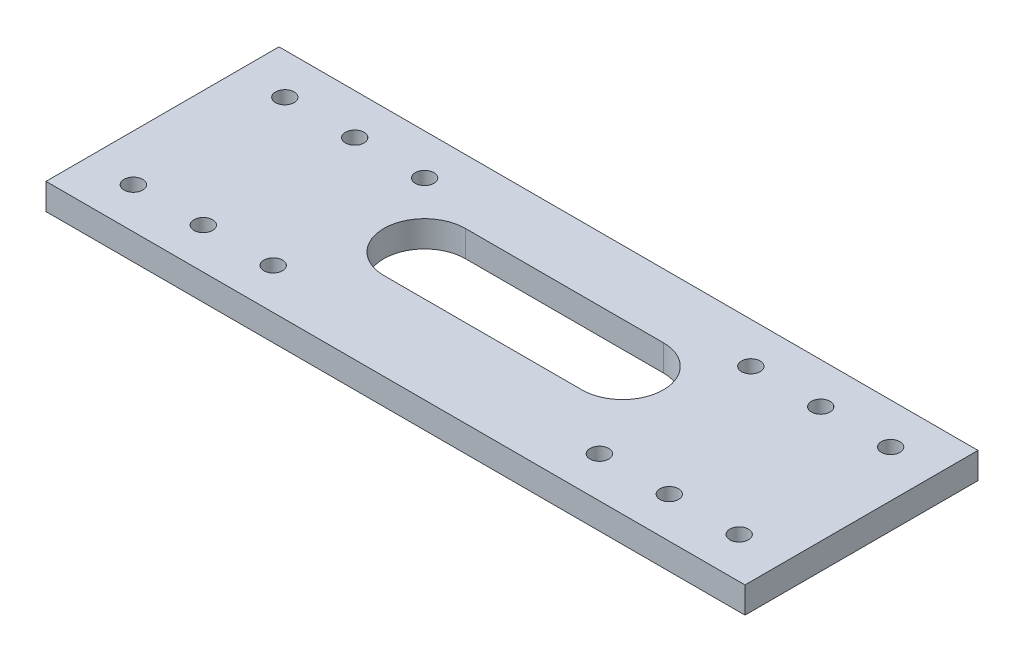
ISO-10303-21;
HEADER;
FILE_DESCRIPTION(('STEP AP214'),'2;1');
FILE_NAME('part.step','',(''),(''),'','','');
FILE_SCHEMA(('AUTOMOTIVE_DESIGN { 1 0 10303 214 1 1 1 1 }'));
ENDSEC;
DATA;
#1=APPLICATION_CONTEXT('core data for automotive mechanical design processes');
#2=APPLICATION_PROTOCOL_DEFINITION('international standard','automotive_design',2000,#1);
#3=PRODUCT_CONTEXT('',#1,'mechanical');
#4=PRODUCT('Part','Part','',(#3));
#5=PRODUCT_RELATED_PRODUCT_CATEGORY('part','',(#4));
#6=PRODUCT_DEFINITION_FORMATION('','',#4);
#7=PRODUCT_DEFINITION_CONTEXT('part definition',#1,'design');
#8=PRODUCT_DEFINITION('design','',#6,#7);
#9=PRODUCT_DEFINITION_SHAPE('','',#8);
#10=(LENGTH_UNIT() NAMED_UNIT(*) SI_UNIT(.MILLI.,.METRE.));
#11=(NAMED_UNIT(*) PLANE_ANGLE_UNIT() SI_UNIT($,.RADIAN.));
#12=(NAMED_UNIT(*) SI_UNIT($,.STERADIAN.) SOLID_ANGLE_UNIT());
#13=UNCERTAINTY_MEASURE_WITH_UNIT(LENGTH_MEASURE(1.E-05),#10,'distance_accuracy_value','');
#14=(GEOMETRIC_REPRESENTATION_CONTEXT(3) GLOBAL_UNCERTAINTY_ASSIGNED_CONTEXT((#13)) GLOBAL_UNIT_ASSIGNED_CONTEXT((#10,
#11,#12)) REPRESENTATION_CONTEXT('',''));
#15=CARTESIAN_POINT('',(0.,0.,0.));
#16=DIRECTION('',(0.,0.,1.));
#17=DIRECTION('',(1.,0.,0.));
#18=AXIS2_PLACEMENT_3D('',#15,#16,#17);
#19=CARTESIAN_POINT('',(0.,4.5,0.));
#20=DIRECTION('',(1.,0.,0.));
#21=DIRECTION('',(0.,0.,-1.));
#22=AXIS2_PLACEMENT_3D('',#19,#20,#21);
#23=PLANE('',#22);
#24=DIRECTION('',(0.,0.,1.));
#25=VECTOR('',#24,1.);
#26=CARTESIAN_POINT('',(0.,0.,0.));
#27=LINE('',#26,#25);
#28=CARTESIAN_POINT('',(0.,0.,-40.));
#29=VERTEX_POINT('',#28);
#30=CARTESIAN_POINT('',(0.,0.,0.));
#31=VERTEX_POINT('',#30);
#32=EDGE_CURVE('E193',#29,#31,#27,.T.);
#33=ORIENTED_EDGE('',*,*,#32,.T.);
#34=DIRECTION('',(0.,-1.,0.));
#35=VECTOR('',#34,1.);
#36=CARTESIAN_POINT('',(0.,4.5,0.));
#37=LINE('',#36,#35);
#38=CARTESIAN_POINT('',(0.,4.5,0.));
#39=VERTEX_POINT('',#38);
#40=EDGE_CURVE('E11',#39,#31,#37,.T.);
#41=ORIENTED_EDGE('',*,*,#40,.F.);
#42=DIRECTION('',(0.,0.,1.));
#43=VECTOR('',#42,1.);
#44=CARTESIAN_POINT('',(0.,4.5,0.));
#45=LINE('',#44,#43);
#46=CARTESIAN_POINT('',(0.,4.5,-40.));
#47=VERTEX_POINT('',#46);
#48=EDGE_CURVE('E196',#47,#39,#45,.T.);
#49=ORIENTED_EDGE('',*,*,#48,.F.);
#50=DIRECTION('',(0.,-1.,0.));
#51=VECTOR('',#50,1.);
#52=CARTESIAN_POINT('',(0.,4.5,-40.));
#53=LINE('',#52,#51);
#54=EDGE_CURVE('E206',#47,#29,#53,.T.);
#55=ORIENTED_EDGE('',*,*,#54,.T.);
#56=EDGE_LOOP('',(#33,#41,#49,#55));
#57=FACE_BOUND('',#56,.T.);
#58=ADVANCED_FACE('F37',(#57),#23,.F.);
#59=CARTESIAN_POINT('',(0.,4.5,0.));
#60=DIRECTION('',(0.,0.,-1.));
#61=DIRECTION('',(-1.,0.,0.));
#62=AXIS2_PLACEMENT_3D('',#59,#60,#61);
#63=PLANE('',#62);
#64=DIRECTION('',(1.,0.,0.));
#65=VECTOR('',#64,1.);
#66=CARTESIAN_POINT('',(0.,0.,0.));
#67=LINE('',#66,#65);
#68=CARTESIAN_POINT('',(120.,0.,0.));
#69=VERTEX_POINT('',#68);
#70=EDGE_CURVE('E209',#31,#69,#67,.T.);
#71=ORIENTED_EDGE('',*,*,#70,.T.);
#72=DIRECTION('',(0.,-1.,0.));
#73=VECTOR('',#72,1.);
#74=CARTESIAN_POINT('',(120.,4.5,0.));
#75=LINE('',#74,#73);
#76=CARTESIAN_POINT('',(120.,4.5,0.));
#77=VERTEX_POINT('',#76);
#78=EDGE_CURVE('E44',#77,#69,#75,.T.);
#79=ORIENTED_EDGE('',*,*,#78,.F.);
#80=DIRECTION('',(1.,0.,0.));
#81=VECTOR('',#80,1.);
#82=CARTESIAN_POINT('',(0.,4.5,0.));
#83=LINE('',#82,#81);
#84=EDGE_CURVE('E199',#39,#77,#83,.T.);
#85=ORIENTED_EDGE('',*,*,#84,.F.);
#86=ORIENTED_EDGE('',*,*,#40,.T.);
#87=EDGE_LOOP('',(#71,#79,#85,#86));
#88=FACE_BOUND('',#87,.T.);
#89=ADVANCED_FACE('F238',(#88),#63,.F.);
#90=CARTESIAN_POINT('',(120.,4.5,0.));
#91=DIRECTION('',(-1.,0.,0.));
#92=DIRECTION('',(0.,0.,1.));
#93=AXIS2_PLACEMENT_3D('',#90,#91,#92);
#94=PLANE('',#93);
#95=DIRECTION('',(0.,0.,-1.));
#96=VECTOR('',#95,1.);
#97=CARTESIAN_POINT('',(120.,0.,0.));
#98=LINE('',#97,#96);
#99=CARTESIAN_POINT('',(120.,0.,-40.));
#100=VERTEX_POINT('',#99);
#101=EDGE_CURVE('E211',#69,#100,#98,.T.);
#102=ORIENTED_EDGE('',*,*,#101,.T.);
#103=DIRECTION('',(0.,-1.,0.));
#104=VECTOR('',#103,1.);
#105=CARTESIAN_POINT('',(120.,4.5,-40.));
#106=LINE('',#105,#104);
#107=CARTESIAN_POINT('',(120.,4.5,-40.));
#108=VERTEX_POINT('',#107);
#109=EDGE_CURVE('E216',#108,#100,#106,.T.);
#110=ORIENTED_EDGE('',*,*,#109,.F.);
#111=DIRECTION('',(0.,0.,-1.));
#112=VECTOR('',#111,1.);
#113=CARTESIAN_POINT('',(120.,4.5,0.));
#114=LINE('',#113,#112);
#115=EDGE_CURVE('E202',#77,#108,#114,.T.);
#116=ORIENTED_EDGE('',*,*,#115,.F.);
#117=ORIENTED_EDGE('',*,*,#78,.T.);
#118=EDGE_LOOP('',(#102,#110,#116,#117));
#119=FACE_BOUND('',#118,.T.);
#120=ADVANCED_FACE('F223',(#119),#94,.F.);
#121=CARTESIAN_POINT('',(0.,4.5,-40.));
#122=DIRECTION('',(0.,0.,1.));
#123=DIRECTION('',(1.,0.,0.));
#124=AXIS2_PLACEMENT_3D('',#121,#122,#123);
#125=PLANE('',#124);
#126=DIRECTION('',(-1.,0.,0.));
#127=VECTOR('',#126,1.);
#128=CARTESIAN_POINT('',(0.,0.,-40.));
#129=LINE('',#128,#127);
#130=EDGE_CURVE('E200',#100,#29,#129,.T.);
#131=ORIENTED_EDGE('',*,*,#130,.T.);
#132=ORIENTED_EDGE('',*,*,#54,.F.);
#133=DIRECTION('',(-1.,0.,0.));
#134=VECTOR('',#133,1.);
#135=CARTESIAN_POINT('',(0.,4.5,-40.));
#136=LINE('',#135,#134);
#137=EDGE_CURVE('E204',#108,#47,#136,.T.);
#138=ORIENTED_EDGE('',*,*,#137,.F.);
#139=ORIENTED_EDGE('',*,*,#109,.T.);
#140=EDGE_LOOP('',(#131,#132,#138,#139));
#141=FACE_BOUND('',#140,.T.);
#142=ADVANCED_FACE('F232',(#141),#125,.F.);
#143=CARTESIAN_POINT('',(0.,4.5,0.));
#144=DIRECTION('',(0.,-1.,0.));
#145=DIRECTION('',(0.,0.,-1.));
#146=AXIS2_PLACEMENT_3D('',#143,#144,#145);
#147=PLANE('',#146);
#148=CARTESIAN_POINT('',(112.,4.5,-7.00000000000265));
#149=DIRECTION('',(0.,-1.,0.));
#150=DIRECTION('',(0.,0.,-1.));
#151=AXIS2_PLACEMENT_3D('',#148,#149,#150);
#152=CIRCLE('',#151,1.60000000000067);
#153=CARTESIAN_POINT('',(112.,4.5,-8.60000000000332));
#154=VERTEX_POINT('',#153);
#155=EDGE_CURVE('E159',#154,#154,#152,.T.);
#156=ORIENTED_EDGE('',*,*,#155,.T.);
#157=EDGE_LOOP('',(#156));
#158=FACE_BOUND('',#157,.T.);
#159=CARTESIAN_POINT('',(112.,4.5,-33.0000000000026));
#160=DIRECTION('',(0.,-1.,0.));
#161=DIRECTION('',(0.,0.,-1.));
#162=AXIS2_PLACEMENT_3D('',#159,#160,#161);
#163=CIRCLE('',#162,1.60000000000067);
#164=CARTESIAN_POINT('',(112.,4.5,-34.6000000000033));
#165=VERTEX_POINT('',#164);
#166=EDGE_CURVE('E153',#165,#165,#163,.T.);
#167=ORIENTED_EDGE('',*,*,#166,.T.);
#168=EDGE_LOOP('',(#167));
#169=FACE_BOUND('',#168,.T.);
#170=CARTESIAN_POINT('',(20.,4.5,-7.00000000000264));
#171=DIRECTION('',(0.,-1.,0.));
#172=DIRECTION('',(0.,0.,-1.));
#173=AXIS2_PLACEMENT_3D('',#170,#171,#172);
#174=CIRCLE('',#173,1.60000000000067);
#175=CARTESIAN_POINT('',(20.,4.5,-8.60000000000331));
#176=VERTEX_POINT('',#175);
#177=EDGE_CURVE('E147',#176,#176,#174,.T.);
#178=ORIENTED_EDGE('',*,*,#177,.T.);
#179=EDGE_LOOP('',(#178));
#180=FACE_BOUND('',#179,.T.);
#181=CARTESIAN_POINT('',(100.,4.5,-7.00000000000266));
#182=DIRECTION('',(0.,-1.,0.));
#183=DIRECTION('',(0.,0.,-1.));
#184=AXIS2_PLACEMENT_3D('',#181,#182,#183);
#185=CIRCLE('',#184,1.60000000000067);
#186=CARTESIAN_POINT('',(100.,4.5,-8.60000000000333));
#187=VERTEX_POINT('',#186);
#188=EDGE_CURVE('E140',#187,#187,#185,.T.);
#189=ORIENTED_EDGE('',*,*,#188,.T.);
#190=EDGE_LOOP('',(#189));
#191=FACE_BOUND('',#190,.T.);
#192=CARTESIAN_POINT('',(32.,4.5,-33.0000000000026));
#193=DIRECTION('',(0.,-1.,0.));
#194=DIRECTION('',(0.,0.,-1.));
#195=AXIS2_PLACEMENT_3D('',#192,#193,#194);
#196=CIRCLE('',#195,1.60000000000066);
#197=CARTESIAN_POINT('',(32.,4.5,-34.6000000000033));
#198=VERTEX_POINT('',#197);
#199=EDGE_CURVE('E178',#198,#198,#196,.T.);
#200=ORIENTED_EDGE('',*,*,#199,.T.);
#201=EDGE_LOOP('',(#200));
#202=FACE_BOUND('',#201,.T.);
#203=CARTESIAN_POINT('',(32.,4.5,-7.00000000000264));
#204=DIRECTION('',(0.,-1.,0.));
#205=DIRECTION('',(0.,0.,-1.));
#206=AXIS2_PLACEMENT_3D('',#203,#204,#205);
#207=CIRCLE('',#206,1.60000000000066);
#208=CARTESIAN_POINT('',(32.,4.5,-8.60000000000331));
#209=VERTEX_POINT('',#208);
#210=EDGE_CURVE('E185',#209,#209,#207,.T.);
#211=ORIENTED_EDGE('',*,*,#210,.T.);
#212=EDGE_LOOP('',(#211));
#213=FACE_BOUND('',#212,.T.);
#214=CARTESIAN_POINT('',(100.,4.5,-33.0000000000026));
#215=DIRECTION('',(0.,-1.,0.));
#216=DIRECTION('',(0.,0.,-1.));
#217=AXIS2_PLACEMENT_3D('',#214,#215,#216);
#218=CIRCLE('',#217,1.60000000000067);
#219=CARTESIAN_POINT('',(100.,4.5,-34.6000000000033));
#220=VERTEX_POINT('',#219);
#221=EDGE_CURVE('E166',#220,#220,#218,.T.);
#222=ORIENTED_EDGE('',*,*,#221,.T.);
#223=EDGE_LOOP('',(#222));
#224=FACE_BOUND('',#223,.T.);
#225=CARTESIAN_POINT('',(20.,4.5,-33.0000000000026));
#226=DIRECTION('',(0.,-1.,0.));
#227=DIRECTION('',(0.,0.,-1.));
#228=AXIS2_PLACEMENT_3D('',#225,#226,#227);
#229=CIRCLE('',#228,1.60000000000067);
#230=CARTESIAN_POINT('',(20.,4.5,-34.6000000000033));
#231=VERTEX_POINT('',#230);
#232=EDGE_CURVE('E173',#231,#231,#229,.T.);
#233=ORIENTED_EDGE('',*,*,#232,.T.);
#234=EDGE_LOOP('',(#233));
#235=FACE_BOUND('',#234,.T.);
#236=CARTESIAN_POINT('',(8.,4.5,-33.0000000000026));
#237=DIRECTION('',(0.,-1.,0.));
#238=DIRECTION('',(0.,0.,-1.));
#239=AXIS2_PLACEMENT_3D('',#236,#237,#238);
#240=CIRCLE('',#239,1.60000000000067);
#241=CARTESIAN_POINT('',(8.,4.5,-34.6000000000033));
#242=VERTEX_POINT('',#241);
#243=EDGE_CURVE('E165',#242,#242,#240,.T.);
#244=ORIENTED_EDGE('',*,*,#243,.T.);
#245=EDGE_LOOP('',(#244));
#246=FACE_BOUND('',#245,.T.);
#247=CARTESIAN_POINT('',(88.,4.5,-33.0000000000026));
#248=DIRECTION('',(0.,-1.,0.));
#249=DIRECTION('',(0.,0.,-1.));
#250=AXIS2_PLACEMENT_3D('',#247,#248,#249);
#251=CIRCLE('',#250,1.60000000000067);
#252=CARTESIAN_POINT('',(88.,4.5,-34.6000000000033));
#253=VERTEX_POINT('',#252);
#254=EDGE_CURVE('E321',#253,#253,#251,.T.);
#255=ORIENTED_EDGE('',*,*,#254,.T.);
#256=EDGE_LOOP('',(#255));
#257=FACE_BOUND('',#256,.T.);
#258=CARTESIAN_POINT('',(88.,4.5,-7.00000000000266));
#259=DIRECTION('',(0.,-1.,0.));
#260=DIRECTION('',(0.,0.,-1.));
#261=AXIS2_PLACEMENT_3D('',#258,#259,#260);
#262=CIRCLE('',#261,1.60000000000067);
#263=CARTESIAN_POINT('',(88.,4.5,-8.60000000000333));
#264=VERTEX_POINT('',#263);
#265=EDGE_CURVE('E329',#264,#264,#262,.T.);
#266=ORIENTED_EDGE('',*,*,#265,.T.);
#267=EDGE_LOOP('',(#266));
#268=FACE_BOUND('',#267,.T.);
#269=DIRECTION('',(-1.,0.,0.));
#270=VECTOR('',#269,1.);
#271=CARTESIAN_POINT('',(77.,4.5,-15.0000000000026));
#272=LINE('',#271,#270);
#273=CARTESIAN_POINT('',(77.,4.5,-15.0000000000026));
#274=VERTEX_POINT('',#273);
#275=CARTESIAN_POINT('',(43.,4.5,-15.0000000000026));
#276=VERTEX_POINT('',#275);
#277=EDGE_CURVE('E109',#274,#276,#272,.T.);
#278=ORIENTED_EDGE('',*,*,#277,.T.);
#279=CARTESIAN_POINT('',(43.,4.5,-22.0000000000026));
#280=DIRECTION('',(0.,-1.,0.));
#281=DIRECTION('',(0.,0.,-1.));
#282=AXIS2_PLACEMENT_3D('',#279,#280,#281);
#283=CIRCLE('',#282,7.);
#284=CARTESIAN_POINT('',(43.,4.5,-29.0000000000026));
#285=VERTEX_POINT('',#284);
#286=EDGE_CURVE('E103',#276,#285,#283,.T.);
#287=ORIENTED_EDGE('',*,*,#286,.T.);
#288=DIRECTION('',(1.,0.,0.));
#289=VECTOR('',#288,1.);
#290=CARTESIAN_POINT('',(43.,4.5,-29.0000000000026));
#291=LINE('',#290,#289);
#292=CARTESIAN_POINT('',(77.,4.5,-29.0000000000026));
#293=VERTEX_POINT('',#292);
#294=EDGE_CURVE('E112',#285,#293,#291,.T.);
#295=ORIENTED_EDGE('',*,*,#294,.T.);
#296=CARTESIAN_POINT('',(77.,4.5,-22.0000000000026));
#297=DIRECTION('',(0.,-1.,0.));
#298=DIRECTION('',(0.,0.,-1.));
#299=AXIS2_PLACEMENT_3D('',#296,#297,#298);
#300=CIRCLE('',#299,7.);
#301=EDGE_CURVE('E51',#293,#274,#300,.T.);
#302=ORIENTED_EDGE('',*,*,#301,.T.);
#303=EDGE_LOOP('',(#278,#287,#295,#302));
#304=FACE_BOUND('',#303,.T.);
#305=CARTESIAN_POINT('',(8.,4.5,-7.00000000000265));
#306=DIRECTION('',(0.,-1.,0.));
#307=DIRECTION('',(0.,0.,-1.));
#308=AXIS2_PLACEMENT_3D('',#305,#306,#307);
#309=CIRCLE('',#308,1.60000000000067);
#310=CARTESIAN_POINT('',(8.,4.5,-8.60000000000332));
#311=VERTEX_POINT('',#310);
#312=EDGE_CURVE('E190',#311,#311,#309,.T.);
#313=ORIENTED_EDGE('',*,*,#312,.T.);
#314=EDGE_LOOP('',(#313));
#315=FACE_BOUND('',#314,.T.);
#316=ORIENTED_EDGE('',*,*,#48,.T.);
#317=ORIENTED_EDGE('',*,*,#84,.T.);
#318=ORIENTED_EDGE('',*,*,#115,.T.);
#319=ORIENTED_EDGE('',*,*,#137,.T.);
#320=EDGE_LOOP('',(#316,#317,#318,#319));
#321=FACE_BOUND('',#320,.T.);
#322=ADVANCED_FACE('F116',(#158,#169,#180,#191,#202,#213,#224,#235,#246,#257,#268,#304,#315,
#321),#147,.F.);
#323=CARTESIAN_POINT('',(0.,0.,0.));
#324=DIRECTION('',(0.,-1.,0.));
#325=DIRECTION('',(0.,0.,-1.));
#326=AXIS2_PLACEMENT_3D('',#323,#324,#325);
#327=PLANE('',#326);
#328=CARTESIAN_POINT('',(112.,0.,-7.00000000000265));
#329=DIRECTION('',(0.,-1.,0.));
#330=DIRECTION('',(0.,0.,-1.));
#331=AXIS2_PLACEMENT_3D('',#328,#329,#330);
#332=CIRCLE('',#331,1.60000000000067);
#333=CARTESIAN_POINT('',(112.,0.,-8.60000000000332));
#334=VERTEX_POINT('',#333);
#335=EDGE_CURVE('E162',#334,#334,#332,.T.);
#336=ORIENTED_EDGE('',*,*,#335,.F.);
#337=EDGE_LOOP('',(#336));
#338=FACE_BOUND('',#337,.T.);
#339=CARTESIAN_POINT('',(112.,0.,-33.0000000000026));
#340=DIRECTION('',(0.,-1.,0.));
#341=DIRECTION('',(0.,0.,-1.));
#342=AXIS2_PLACEMENT_3D('',#339,#340,#341);
#343=CIRCLE('',#342,1.60000000000067);
#344=CARTESIAN_POINT('',(112.,0.,-34.6000000000033));
#345=VERTEX_POINT('',#344);
#346=EDGE_CURVE('E156',#345,#345,#343,.T.);
#347=ORIENTED_EDGE('',*,*,#346,.F.);
#348=EDGE_LOOP('',(#347));
#349=FACE_BOUND('',#348,.T.);
#350=CARTESIAN_POINT('',(20.,0.,-7.00000000000264));
#351=DIRECTION('',(0.,-1.,0.));
#352=DIRECTION('',(0.,0.,-1.));
#353=AXIS2_PLACEMENT_3D('',#350,#351,#352);
#354=CIRCLE('',#353,1.60000000000067);
#355=CARTESIAN_POINT('',(20.,0.,-8.60000000000331));
#356=VERTEX_POINT('',#355);
#357=EDGE_CURVE('E150',#356,#356,#354,.T.);
#358=ORIENTED_EDGE('',*,*,#357,.F.);
#359=EDGE_LOOP('',(#358));
#360=FACE_BOUND('',#359,.T.);
#361=CARTESIAN_POINT('',(100.,0.,-7.00000000000266));
#362=DIRECTION('',(0.,-1.,0.));
#363=DIRECTION('',(0.,0.,-1.));
#364=AXIS2_PLACEMENT_3D('',#361,#362,#363);
#365=CIRCLE('',#364,1.60000000000067);
#366=CARTESIAN_POINT('',(100.,0.,-8.60000000000333));
#367=VERTEX_POINT('',#366);
#368=EDGE_CURVE('E144',#367,#367,#365,.T.);
#369=ORIENTED_EDGE('',*,*,#368,.F.);
#370=EDGE_LOOP('',(#369));
#371=FACE_BOUND('',#370,.T.);
#372=CARTESIAN_POINT('',(32.,0.,-33.0000000000026));
#373=DIRECTION('',(0.,-1.,0.));
#374=DIRECTION('',(0.,0.,-1.));
#375=AXIS2_PLACEMENT_3D('',#372,#373,#374);
#376=CIRCLE('',#375,1.60000000000066);
#377=CARTESIAN_POINT('',(32.,0.,-34.6000000000033));
#378=VERTEX_POINT('',#377);
#379=EDGE_CURVE('E182',#378,#378,#376,.T.);
#380=ORIENTED_EDGE('',*,*,#379,.F.);
#381=EDGE_LOOP('',(#380));
#382=FACE_BOUND('',#381,.T.);
#383=CARTESIAN_POINT('',(32.,0.,-7.00000000000264));
#384=DIRECTION('',(0.,-1.,0.));
#385=DIRECTION('',(0.,0.,-1.));
#386=AXIS2_PLACEMENT_3D('',#383,#384,#385);
#387=CIRCLE('',#386,1.60000000000066);
#388=CARTESIAN_POINT('',(32.,0.,-8.60000000000331));
#389=VERTEX_POINT('',#388);
#390=EDGE_CURVE('E169',#389,#389,#387,.T.);
#391=ORIENTED_EDGE('',*,*,#390,.F.);
#392=EDGE_LOOP('',(#391));
#393=FACE_BOUND('',#392,.T.);
#394=CARTESIAN_POINT('',(100.,0.,-33.0000000000026));
#395=DIRECTION('',(0.,-1.,0.));
#396=DIRECTION('',(0.,0.,-1.));
#397=AXIS2_PLACEMENT_3D('',#394,#395,#396);
#398=CIRCLE('',#397,1.60000000000067);
#399=CARTESIAN_POINT('',(100.,0.,-34.6000000000033));
#400=VERTEX_POINT('',#399);
#401=EDGE_CURVE('E170',#400,#400,#398,.T.);
#402=ORIENTED_EDGE('',*,*,#401,.F.);
#403=EDGE_LOOP('',(#402));
#404=FACE_BOUND('',#403,.T.);
#405=CARTESIAN_POINT('',(20.,0.,-33.0000000000026));
#406=DIRECTION('',(0.,-1.,0.));
#407=DIRECTION('',(0.,0.,-1.));
#408=AXIS2_PLACEMENT_3D('',#405,#406,#407);
#409=CIRCLE('',#408,1.60000000000067);
#410=CARTESIAN_POINT('',(20.,0.,-34.6000000000033));
#411=VERTEX_POINT('',#410);
#412=EDGE_CURVE('E143',#411,#411,#409,.T.);
#413=ORIENTED_EDGE('',*,*,#412,.F.);
#414=EDGE_LOOP('',(#413));
#415=FACE_BOUND('',#414,.T.);
#416=CARTESIAN_POINT('',(8.,0.,-33.0000000000026));
#417=DIRECTION('',(0.,-1.,0.));
#418=DIRECTION('',(0.,0.,-1.));
#419=AXIS2_PLACEMENT_3D('',#416,#417,#418);
#420=CIRCLE('',#419,1.60000000000067);
#421=CARTESIAN_POINT('',(8.,0.,-34.6000000000033));
#422=VERTEX_POINT('',#421);
#423=EDGE_CURVE('E319',#422,#422,#420,.T.);
#424=ORIENTED_EDGE('',*,*,#423,.F.);
#425=EDGE_LOOP('',(#424));
#426=FACE_BOUND('',#425,.T.);
#427=CARTESIAN_POINT('',(88.,0.,-33.0000000000026));
#428=DIRECTION('',(0.,-1.,0.));
#429=DIRECTION('',(0.,0.,-1.));
#430=AXIS2_PLACEMENT_3D('',#427,#428,#429);
#431=CIRCLE('',#430,1.60000000000067);
#432=CARTESIAN_POINT('',(88.,0.,-34.6000000000033));
#433=VERTEX_POINT('',#432);
#434=EDGE_CURVE('E325',#433,#433,#431,.T.);
#435=ORIENTED_EDGE('',*,*,#434,.F.);
#436=EDGE_LOOP('',(#435));
#437=FACE_BOUND('',#436,.T.);
#438=CARTESIAN_POINT('',(88.,0.,-7.00000000000266));
#439=DIRECTION('',(0.,-1.,0.));
#440=DIRECTION('',(0.,0.,-1.));
#441=AXIS2_PLACEMENT_3D('',#438,#439,#440);
#442=CIRCLE('',#441,1.60000000000067);
#443=CARTESIAN_POINT('',(88.,0.,-8.60000000000333));
#444=VERTEX_POINT('',#443);
#445=EDGE_CURVE('E125',#444,#444,#442,.T.);
#446=ORIENTED_EDGE('',*,*,#445,.F.);
#447=EDGE_LOOP('',(#446));
#448=FACE_BOUND('',#447,.T.);
#449=CARTESIAN_POINT('',(43.,0.,-22.0000000000026));
#450=DIRECTION('',(0.,-1.,0.));
#451=DIRECTION('',(0.,0.,-1.));
#452=AXIS2_PLACEMENT_3D('',#449,#450,#451);
#453=CIRCLE('',#452,7.);
#454=CARTESIAN_POINT('',(43.,0.,-15.0000000000026));
#455=VERTEX_POINT('',#454);
#456=CARTESIAN_POINT('',(43.,0.,-29.0000000000026));
#457=VERTEX_POINT('',#456);
#458=EDGE_CURVE('E59',#455,#457,#453,.T.);
#459=ORIENTED_EDGE('',*,*,#458,.F.);
#460=DIRECTION('',(-1.,0.,0.));
#461=VECTOR('',#460,1.);
#462=CARTESIAN_POINT('',(77.,0.,-15.0000000000026));
#463=LINE('',#462,#461);
#464=CARTESIAN_POINT('',(77.,0.,-15.0000000000026));
#465=VERTEX_POINT('',#464);
#466=EDGE_CURVE('E119',#465,#455,#463,.T.);
#467=ORIENTED_EDGE('',*,*,#466,.F.);
#468=CARTESIAN_POINT('',(77.,0.,-22.0000000000026));
#469=DIRECTION('',(0.,-1.,0.));
#470=DIRECTION('',(0.,0.,-1.));
#471=AXIS2_PLACEMENT_3D('',#468,#469,#470);
#472=CIRCLE('',#471,7.);
#473=CARTESIAN_POINT('',(77.,0.,-29.0000000000026));
#474=VERTEX_POINT('',#473);
#475=EDGE_CURVE('E122',#474,#465,#472,.T.);
#476=ORIENTED_EDGE('',*,*,#475,.F.);
#477=DIRECTION('',(1.,0.,0.));
#478=VECTOR('',#477,1.);
#479=CARTESIAN_POINT('',(43.,0.,-29.0000000000026));
#480=LINE('',#479,#478);
#481=EDGE_CURVE('E131',#457,#474,#480,.T.);
#482=ORIENTED_EDGE('',*,*,#481,.F.);
#483=EDGE_LOOP('',(#459,#467,#476,#482));
#484=FACE_BOUND('',#483,.T.);
#485=CARTESIAN_POINT('',(8.,0.,-7.00000000000265));
#486=DIRECTION('',(0.,-1.,0.));
#487=DIRECTION('',(0.,0.,-1.));
#488=AXIS2_PLACEMENT_3D('',#485,#486,#487);
#489=CIRCLE('',#488,1.60000000000067);
#490=CARTESIAN_POINT('',(8.,0.,-8.60000000000332));
#491=VERTEX_POINT('',#490);
#492=EDGE_CURVE('E181',#491,#491,#489,.T.);
#493=ORIENTED_EDGE('',*,*,#492,.F.);
#494=EDGE_LOOP('',(#493));
#495=FACE_BOUND('',#494,.T.);
#496=ORIENTED_EDGE('',*,*,#32,.F.);
#497=ORIENTED_EDGE('',*,*,#130,.F.);
#498=ORIENTED_EDGE('',*,*,#101,.F.);
#499=ORIENTED_EDGE('',*,*,#70,.F.);
#500=EDGE_LOOP('',(#496,#497,#498,#499));
#501=FACE_BOUND('',#500,.T.);
#502=ADVANCED_FACE('F229',(#338,#349,#360,#371,#382,#393,#404,#415,#426,#437,#448,#484,#495,
#501),#327,.T.);
#503=CARTESIAN_POINT('',(8.,4.5,-7.00000000000265));
#504=DIRECTION('',(0.,-1.,0.));
#505=DIRECTION('',(0.,0.,-1.));
#506=AXIS2_PLACEMENT_3D('',#503,#504,#505);
#507=CYLINDRICAL_SURFACE('',#506,1.60000000000067);
#508=ORIENTED_EDGE('',*,*,#312,.F.);
#509=EDGE_LOOP('',(#508));
#510=FACE_BOUND('',#509,.T.);
#511=ORIENTED_EDGE('',*,*,#492,.T.);
#512=EDGE_LOOP('',(#511));
#513=FACE_BOUND('',#512,.T.);
#514=ADVANCED_FACE('F250',(#510,#513),#507,.F.);
#515=CARTESIAN_POINT('',(43.,4.5,-22.0000000000026));
#516=DIRECTION('',(0.,-1.,0.));
#517=DIRECTION('',(0.,0.,-1.));
#518=AXIS2_PLACEMENT_3D('',#515,#516,#517);
#519=CYLINDRICAL_SURFACE('',#518,7.);
#520=ORIENTED_EDGE('',*,*,#458,.T.);
#521=DIRECTION('',(0.,-1.,0.));
#522=VECTOR('',#521,1.);
#523=CARTESIAN_POINT('',(43.,4.5,-29.0000000000026));
#524=LINE('',#523,#522);
#525=EDGE_CURVE('E99',#285,#457,#524,.T.);
#526=ORIENTED_EDGE('',*,*,#525,.F.);
#527=ORIENTED_EDGE('',*,*,#286,.F.);
#528=DIRECTION('',(0.,-1.,0.));
#529=VECTOR('',#528,1.);
#530=CARTESIAN_POINT('',(43.,4.5,-15.0000000000026));
#531=LINE('',#530,#529);
#532=EDGE_CURVE('E135',#276,#455,#531,.T.);
#533=ORIENTED_EDGE('',*,*,#532,.T.);
#534=EDGE_LOOP('',(#520,#526,#527,#533));
#535=FACE_BOUND('',#534,.T.);
#536=ADVANCED_FACE('F101',(#535),#519,.F.);
#537=CARTESIAN_POINT('',(77.,4.5,-15.0000000000026));
#538=DIRECTION('',(0.,0.,1.));
#539=DIRECTION('',(1.,0.,0.));
#540=AXIS2_PLACEMENT_3D('',#537,#538,#539);
#541=PLANE('',#540);
#542=ORIENTED_EDGE('',*,*,#466,.T.);
#543=ORIENTED_EDGE('',*,*,#532,.F.);
#544=ORIENTED_EDGE('',*,*,#277,.F.);
#545=DIRECTION('',(0.,-1.,0.));
#546=VECTOR('',#545,1.);
#547=CARTESIAN_POINT('',(77.,4.5,-15.0000000000026));
#548=LINE('',#547,#546);
#549=EDGE_CURVE('E137',#274,#465,#548,.T.);
#550=ORIENTED_EDGE('',*,*,#549,.T.);
#551=EDGE_LOOP('',(#542,#543,#544,#550));
#552=FACE_BOUND('',#551,.T.);
#553=ADVANCED_FACE('F293',(#552),#541,.F.);
#554=CARTESIAN_POINT('',(77.,4.5,-22.0000000000026));
#555=DIRECTION('',(0.,-1.,0.));
#556=DIRECTION('',(0.,0.,-1.));
#557=AXIS2_PLACEMENT_3D('',#554,#555,#556);
#558=CYLINDRICAL_SURFACE('',#557,7.);
#559=ORIENTED_EDGE('',*,*,#475,.T.);
#560=ORIENTED_EDGE('',*,*,#549,.F.);
#561=ORIENTED_EDGE('',*,*,#301,.F.);
#562=DIRECTION('',(0.,-1.,0.));
#563=VECTOR('',#562,1.);
#564=CARTESIAN_POINT('',(77.,4.5,-29.0000000000026));
#565=LINE('',#564,#563);
#566=EDGE_CURVE('E108',#293,#474,#565,.T.);
#567=ORIENTED_EDGE('',*,*,#566,.T.);
#568=EDGE_LOOP('',(#559,#560,#561,#567));
#569=FACE_BOUND('',#568,.T.);
#570=ADVANCED_FACE('F297',(#569),#558,.F.);
#571=CARTESIAN_POINT('',(43.,4.5,-29.0000000000026));
#572=DIRECTION('',(0.,0.,-1.));
#573=DIRECTION('',(-1.,0.,0.));
#574=AXIS2_PLACEMENT_3D('',#571,#572,#573);
#575=PLANE('',#574);
#576=ORIENTED_EDGE('',*,*,#481,.T.);
#577=ORIENTED_EDGE('',*,*,#566,.F.);
#578=ORIENTED_EDGE('',*,*,#294,.F.);
#579=ORIENTED_EDGE('',*,*,#525,.T.);
#580=EDGE_LOOP('',(#576,#577,#578,#579));
#581=FACE_BOUND('',#580,.T.);
#582=ADVANCED_FACE('F113',(#581),#575,.F.);
#583=CARTESIAN_POINT('',(88.,4.5,-7.00000000000266));
#584=DIRECTION('',(0.,-1.,0.));
#585=DIRECTION('',(0.,0.,-1.));
#586=AXIS2_PLACEMENT_3D('',#583,#584,#585);
#587=CYLINDRICAL_SURFACE('',#586,1.60000000000067);
#588=ORIENTED_EDGE('',*,*,#265,.F.);
#589=EDGE_LOOP('',(#588));
#590=FACE_BOUND('',#589,.T.);
#591=ORIENTED_EDGE('',*,*,#445,.T.);
#592=EDGE_LOOP('',(#591));
#593=FACE_BOUND('',#592,.T.);
#594=ADVANCED_FACE('F296',(#590,#593),#587,.F.);
#595=CARTESIAN_POINT('',(88.,4.5,-33.0000000000026));
#596=DIRECTION('',(0.,-1.,0.));
#597=DIRECTION('',(0.,0.,-1.));
#598=AXIS2_PLACEMENT_3D('',#595,#596,#597);
#599=CYLINDRICAL_SURFACE('',#598,1.60000000000067);
#600=ORIENTED_EDGE('',*,*,#254,.F.);
#601=EDGE_LOOP('',(#600));
#602=FACE_BOUND('',#601,.T.);
#603=ORIENTED_EDGE('',*,*,#434,.T.);
#604=EDGE_LOOP('',(#603));
#605=FACE_BOUND('',#604,.T.);
#606=ADVANCED_FACE('F305',(#602,#605),#599,.F.);
#607=CARTESIAN_POINT('',(8.,4.5,-33.0000000000026));
#608=DIRECTION('',(0.,-1.,0.));
#609=DIRECTION('',(0.,0.,-1.));
#610=AXIS2_PLACEMENT_3D('',#607,#608,#609);
#611=CYLINDRICAL_SURFACE('',#610,1.60000000000067);
#612=ORIENTED_EDGE('',*,*,#243,.F.);
#613=EDGE_LOOP('',(#612));
#614=FACE_BOUND('',#613,.T.);
#615=ORIENTED_EDGE('',*,*,#423,.T.);
#616=EDGE_LOOP('',(#615));
#617=FACE_BOUND('',#616,.T.);
#618=ADVANCED_FACE('F271',(#614,#617),#611,.F.);
#619=CARTESIAN_POINT('',(20.,4.5,-33.0000000000026));
#620=DIRECTION('',(0.,-1.,0.));
#621=DIRECTION('',(0.,0.,-1.));
#622=AXIS2_PLACEMENT_3D('',#619,#620,#621);
#623=CYLINDRICAL_SURFACE('',#622,1.60000000000067);
#624=ORIENTED_EDGE('',*,*,#232,.F.);
#625=EDGE_LOOP('',(#624));
#626=FACE_BOUND('',#625,.T.);
#627=ORIENTED_EDGE('',*,*,#412,.T.);
#628=EDGE_LOOP('',(#627));
#629=FACE_BOUND('',#628,.T.);
#630=ADVANCED_FACE('F268',(#626,#629),#623,.F.);
#631=CARTESIAN_POINT('',(100.,4.5,-33.0000000000026));
#632=DIRECTION('',(0.,-1.,0.));
#633=DIRECTION('',(0.,0.,-1.));
#634=AXIS2_PLACEMENT_3D('',#631,#632,#633);
#635=CYLINDRICAL_SURFACE('',#634,1.60000000000067);
#636=ORIENTED_EDGE('',*,*,#221,.F.);
#637=EDGE_LOOP('',(#636));
#638=FACE_BOUND('',#637,.T.);
#639=ORIENTED_EDGE('',*,*,#401,.T.);
#640=EDGE_LOOP('',(#639));
#641=FACE_BOUND('',#640,.T.);
#642=ADVANCED_FACE('F262',(#638,#641),#635,.F.);
#643=CARTESIAN_POINT('',(32.,4.5,-7.00000000000264));
#644=DIRECTION('',(0.,-1.,0.));
#645=DIRECTION('',(0.,0.,-1.));
#646=AXIS2_PLACEMENT_3D('',#643,#644,#645);
#647=CYLINDRICAL_SURFACE('',#646,1.60000000000066);
#648=ORIENTED_EDGE('',*,*,#210,.F.);
#649=EDGE_LOOP('',(#648));
#650=FACE_BOUND('',#649,.T.);
#651=ORIENTED_EDGE('',*,*,#390,.T.);
#652=EDGE_LOOP('',(#651));
#653=FACE_BOUND('',#652,.T.);
#654=ADVANCED_FACE('F258',(#650,#653),#647,.F.);
#655=CARTESIAN_POINT('',(32.,4.5,-33.0000000000026));
#656=DIRECTION('',(0.,-1.,0.));
#657=DIRECTION('',(0.,0.,-1.));
#658=AXIS2_PLACEMENT_3D('',#655,#656,#657);
#659=CYLINDRICAL_SURFACE('',#658,1.60000000000066);
#660=ORIENTED_EDGE('',*,*,#199,.F.);
#661=EDGE_LOOP('',(#660));
#662=FACE_BOUND('',#661,.T.);
#663=ORIENTED_EDGE('',*,*,#379,.T.);
#664=EDGE_LOOP('',(#663));
#665=FACE_BOUND('',#664,.T.);
#666=ADVANCED_FACE('F261',(#662,#665),#659,.F.);
#667=CARTESIAN_POINT('',(100.,4.5,-7.00000000000266));
#668=DIRECTION('',(0.,-1.,0.));
#669=DIRECTION('',(0.,0.,-1.));
#670=AXIS2_PLACEMENT_3D('',#667,#668,#669);
#671=CYLINDRICAL_SURFACE('',#670,1.60000000000067);
#672=ORIENTED_EDGE('',*,*,#188,.F.);
#673=EDGE_LOOP('',(#672));
#674=FACE_BOUND('',#673,.T.);
#675=ORIENTED_EDGE('',*,*,#368,.T.);
#676=EDGE_LOOP('',(#675));
#677=FACE_BOUND('',#676,.T.);
#678=ADVANCED_FACE('F266',(#674,#677),#671,.F.);
#679=CARTESIAN_POINT('',(20.,4.5,-7.00000000000264));
#680=DIRECTION('',(0.,-1.,0.));
#681=DIRECTION('',(0.,0.,-1.));
#682=AXIS2_PLACEMENT_3D('',#679,#680,#681);
#683=CYLINDRICAL_SURFACE('',#682,1.60000000000067);
#684=ORIENTED_EDGE('',*,*,#177,.F.);
#685=EDGE_LOOP('',(#684));
#686=FACE_BOUND('',#685,.T.);
#687=ORIENTED_EDGE('',*,*,#357,.T.);
#688=EDGE_LOOP('',(#687));
#689=FACE_BOUND('',#688,.T.);
#690=ADVANCED_FACE('F283',(#686,#689),#683,.F.);
#691=CARTESIAN_POINT('',(112.,4.5,-33.0000000000026));
#692=DIRECTION('',(0.,-1.,0.));
#693=DIRECTION('',(0.,0.,-1.));
#694=AXIS2_PLACEMENT_3D('',#691,#692,#693);
#695=CYLINDRICAL_SURFACE('',#694,1.60000000000067);
#696=ORIENTED_EDGE('',*,*,#166,.F.);
#697=EDGE_LOOP('',(#696));
#698=FACE_BOUND('',#697,.T.);
#699=ORIENTED_EDGE('',*,*,#346,.T.);
#700=EDGE_LOOP('',(#699));
#701=FACE_BOUND('',#700,.T.);
#702=ADVANCED_FACE('F279',(#698,#701),#695,.F.);
#703=CARTESIAN_POINT('',(112.,4.5,-7.00000000000265));
#704=DIRECTION('',(0.,-1.,0.));
#705=DIRECTION('',(0.,0.,-1.));
#706=AXIS2_PLACEMENT_3D('',#703,#704,#705);
#707=CYLINDRICAL_SURFACE('',#706,1.60000000000067);
#708=ORIENTED_EDGE('',*,*,#155,.F.);
#709=EDGE_LOOP('',(#708));
#710=FACE_BOUND('',#709,.T.);
#711=ORIENTED_EDGE('',*,*,#335,.T.);
#712=EDGE_LOOP('',(#711));
#713=FACE_BOUND('',#712,.T.);
#714=ADVANCED_FACE('F276',(#710,#713),#707,.F.);
#715=CLOSED_SHELL('',(#58,#89,#120,#142,#322,#502,#514,#536,#553,#570,#582,#594,#606,#618,#630,
#642,#654,#666,#678,#690,#702,#714));
#716=MANIFOLD_SOLID_BREP('B2',#715);
#717=ADVANCED_BREP_SHAPE_REPRESENTATION('',(#18,#716),#14);
#718=SHAPE_DEFINITION_REPRESENTATION(#9,#717);
ENDSEC;
END-ISO-10303-21;
